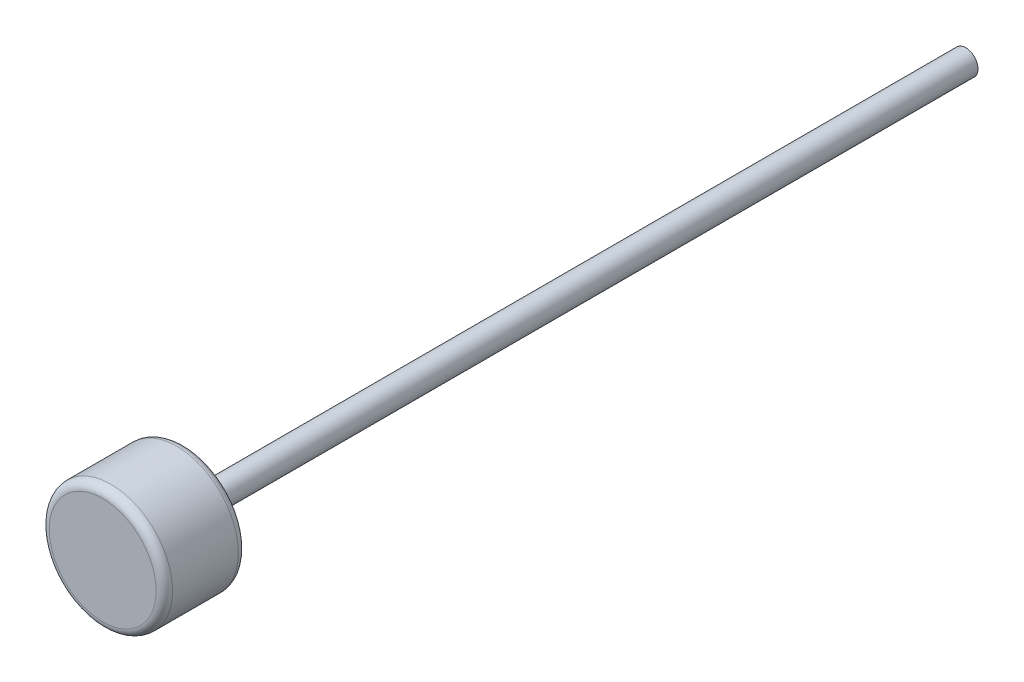
ISO-10303-21;
HEADER;
FILE_DESCRIPTION(('STEP AP214'),'2;1');
FILE_NAME('part.step','',(''),(''),'','','');
FILE_SCHEMA(('AUTOMOTIVE_DESIGN { 1 0 10303 214 1 1 1 1 }'));
ENDSEC;
DATA;
#1=APPLICATION_CONTEXT('core data for automotive mechanical design processes');
#2=APPLICATION_PROTOCOL_DEFINITION('international standard','automotive_design',2000,#1);
#3=PRODUCT_CONTEXT('',#1,'mechanical');
#4=PRODUCT('Part','Part','',(#3));
#5=PRODUCT_RELATED_PRODUCT_CATEGORY('part','',(#4));
#6=PRODUCT_DEFINITION_FORMATION('','',#4);
#7=PRODUCT_DEFINITION_CONTEXT('part definition',#1,'design');
#8=PRODUCT_DEFINITION('design','',#6,#7);
#9=PRODUCT_DEFINITION_SHAPE('','',#8);
#10=(LENGTH_UNIT() NAMED_UNIT(*) SI_UNIT(.MILLI.,.METRE.));
#11=(NAMED_UNIT(*) PLANE_ANGLE_UNIT() SI_UNIT($,.RADIAN.));
#12=(NAMED_UNIT(*) SI_UNIT($,.STERADIAN.) SOLID_ANGLE_UNIT());
#13=UNCERTAINTY_MEASURE_WITH_UNIT(LENGTH_MEASURE(1.E-05),#10,'distance_accuracy_value','');
#14=(GEOMETRIC_REPRESENTATION_CONTEXT(3) GLOBAL_UNCERTAINTY_ASSIGNED_CONTEXT((#13)) GLOBAL_UNIT_ASSIGNED_CONTEXT((#10,
#11,#12)) REPRESENTATION_CONTEXT('',''));
#15=CARTESIAN_POINT('',(0.,0.,0.));
#16=DIRECTION('',(0.,0.,1.));
#17=DIRECTION('',(1.,0.,0.));
#18=AXIS2_PLACEMENT_3D('',#15,#16,#17);
#19=CARTESIAN_POINT('',(0.,0.,95.));
#20=DIRECTION('',(0.,0.,-1.));
#21=DIRECTION('',(-1.,0.,0.));
#22=AXIS2_PLACEMENT_3D('',#19,#20,#21);
#23=CYLINDRICAL_SURFACE('',#22,1.5);
#24=CARTESIAN_POINT('',(0.,0.,95.));
#25=DIRECTION('',(0.,0.,1.));
#26=DIRECTION('',(1.,0.,0.));
#27=AXIS2_PLACEMENT_3D('',#24,#25,#26);
#28=CIRCLE('',#27,1.5);
#29=CARTESIAN_POINT('',(1.5,0.,95.));
#30=VERTEX_POINT('',#29);
#31=EDGE_CURVE('E70',#30,#30,#28,.T.);
#32=ORIENTED_EDGE('',*,*,#31,.F.);
#33=EDGE_LOOP('',(#32));
#34=FACE_BOUND('',#33,.T.);
#35=CARTESIAN_POINT('',(0.,0.,0.));
#36=DIRECTION('',(0.,0.,1.));
#37=DIRECTION('',(1.,0.,0.));
#38=AXIS2_PLACEMENT_3D('',#35,#36,#37);
#39=CIRCLE('',#38,1.5);
#40=CARTESIAN_POINT('',(1.5,0.,0.));
#41=VERTEX_POINT('',#40);
#42=EDGE_CURVE('E66',#41,#41,#39,.T.);
#43=ORIENTED_EDGE('',*,*,#42,.T.);
#44=EDGE_LOOP('',(#43));
#45=FACE_BOUND('',#44,.T.);
#46=ADVANCED_FACE('F43',(#34,#45),#23,.T.);
#47=CARTESIAN_POINT('',(0.,0.,0.));
#48=DIRECTION('',(0.,0.,1.));
#49=DIRECTION('',(1.,0.,0.));
#50=AXIS2_PLACEMENT_3D('',#47,#48,#49);
#51=PLANE('',#50);
#52=ORIENTED_EDGE('',*,*,#42,.F.);
#53=EDGE_LOOP('',(#52));
#54=FACE_BOUND('',#53,.T.);
#55=ADVANCED_FACE('F77',(#54),#51,.F.);
#56=CARTESIAN_POINT('',(0.,0.,105.));
#57=DIRECTION('',(0.,0.,-1.));
#58=DIRECTION('',(-1.,0.,0.));
#59=AXIS2_PLACEMENT_3D('',#56,#57,#58);
#60=CYLINDRICAL_SURFACE('',#59,7.5);
#61=CARTESIAN_POINT('',(0.,0.,96.));
#62=DIRECTION('',(0.,0.,1.));
#63=DIRECTION('',(1.,0.,0.));
#64=AXIS2_PLACEMENT_3D('',#61,#62,#63);
#65=CIRCLE('',#64,7.5);
#66=CARTESIAN_POINT('',(7.5,0.,96.));
#67=VERTEX_POINT('',#66);
#68=EDGE_CURVE('E51',#67,#67,#65,.T.);
#69=ORIENTED_EDGE('',*,*,#68,.T.);
#70=EDGE_LOOP('',(#69));
#71=FACE_BOUND('',#70,.T.);
#72=CARTESIAN_POINT('',(0.,0.,104.));
#73=DIRECTION('',(0.,0.,1.));
#74=DIRECTION('',(1.,0.,0.));
#75=AXIS2_PLACEMENT_3D('',#72,#73,#74);
#76=CIRCLE('',#75,7.5);
#77=CARTESIAN_POINT('',(7.5,0.,104.));
#78=VERTEX_POINT('',#77);
#79=EDGE_CURVE('E57',#78,#78,#76,.F.);
#80=ORIENTED_EDGE('',*,*,#79,.T.);
#81=EDGE_LOOP('',(#80));
#82=FACE_BOUND('',#81,.T.);
#83=ADVANCED_FACE('F84',(#71,#82),#60,.T.);
#84=CARTESIAN_POINT('',(0.,0.,105.));
#85=DIRECTION('',(0.,0.,1.));
#86=DIRECTION('',(1.,0.,0.));
#87=AXIS2_PLACEMENT_3D('',#84,#85,#86);
#88=PLANE('',#87);
#89=CARTESIAN_POINT('',(0.,0.,105.));
#90=DIRECTION('',(0.,0.,1.));
#91=DIRECTION('',(1.,0.,0.));
#92=AXIS2_PLACEMENT_3D('',#89,#90,#91);
#93=CIRCLE('',#92,6.5);
#94=CARTESIAN_POINT('',(6.5,0.,105.));
#95=VERTEX_POINT('',#94);
#96=EDGE_CURVE('E64',#95,#95,#93,.T.);
#97=ORIENTED_EDGE('',*,*,#96,.T.);
#98=EDGE_LOOP('',(#97));
#99=FACE_BOUND('',#98,.T.);
#100=ADVANCED_FACE('F93',(#99),#88,.T.);
#101=CARTESIAN_POINT('',(0.,0.,95.));
#102=DIRECTION('',(0.,0.,1.));
#103=DIRECTION('',(1.,0.,0.));
#104=AXIS2_PLACEMENT_3D('',#101,#102,#103);
#105=PLANE('',#104);
#106=CARTESIAN_POINT('',(0.,0.,95.));
#107=DIRECTION('',(0.,0.,1.));
#108=DIRECTION('',(1.,0.,0.));
#109=AXIS2_PLACEMENT_3D('',#106,#107,#108);
#110=CIRCLE('',#109,6.5);
#111=CARTESIAN_POINT('',(6.5,0.,95.));
#112=VERTEX_POINT('',#111);
#113=EDGE_CURVE('E10',#112,#112,#110,.F.);
#114=ORIENTED_EDGE('',*,*,#113,.T.);
#115=EDGE_LOOP('',(#114));
#116=FACE_BOUND('',#115,.T.);
#117=ORIENTED_EDGE('',*,*,#31,.T.);
#118=EDGE_LOOP('',(#117));
#119=FACE_BOUND('',#118,.T.);
#120=ADVANCED_FACE('F79',(#116,#119),#105,.F.);
#121=CARTESIAN_POINT('',(0.,0.,104.));
#122=DIRECTION('',(0.,0.,1.));
#123=DIRECTION('',(1.,0.,0.));
#124=AXIS2_PLACEMENT_3D('',#121,#122,#123);
#125=TOROIDAL_SURFACE('',#124,6.5,1.);
#126=ORIENTED_EDGE('',*,*,#79,.F.);
#127=EDGE_LOOP('',(#126));
#128=FACE_BOUND('',#127,.T.);
#129=ORIENTED_EDGE('',*,*,#96,.F.);
#130=EDGE_LOOP('',(#129));
#131=FACE_BOUND('',#130,.T.);
#132=ADVANCED_FACE('F94',(#128,#131),#125,.T.);
#133=CARTESIAN_POINT('',(0.,0.,96.));
#134=DIRECTION('',(0.,0.,1.));
#135=DIRECTION('',(1.,0.,0.));
#136=AXIS2_PLACEMENT_3D('',#133,#134,#135);
#137=TOROIDAL_SURFACE('',#136,6.5,1.);
#138=ORIENTED_EDGE('',*,*,#113,.F.);
#139=EDGE_LOOP('',(#138));
#140=FACE_BOUND('',#139,.T.);
#141=ORIENTED_EDGE('',*,*,#68,.F.);
#142=EDGE_LOOP('',(#141));
#143=FACE_BOUND('',#142,.T.);
#144=ADVANCED_FACE('F44',(#140,#143),#137,.T.);
#145=CLOSED_SHELL('',(#46,#55,#83,#100,#120,#132,#144));
#146=MANIFOLD_SOLID_BREP('B2',#145);
#147=ADVANCED_BREP_SHAPE_REPRESENTATION('',(#18,#146),#14);
#148=SHAPE_DEFINITION_REPRESENTATION(#9,#147);
ENDSEC;
END-ISO-10303-21;
